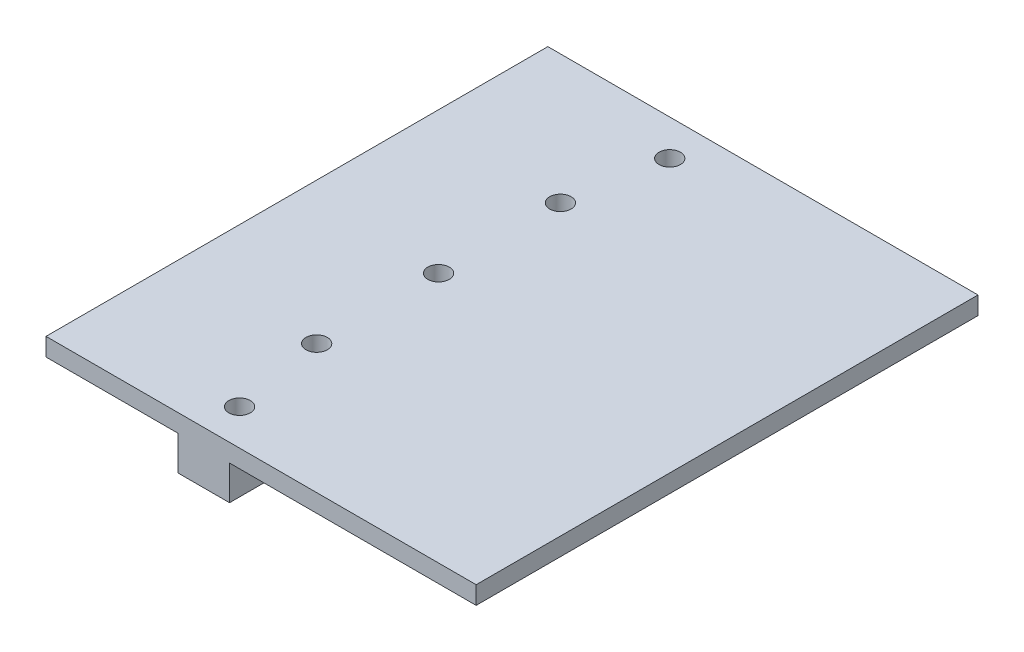
ISO-10303-21;
HEADER;
FILE_DESCRIPTION(('STEP AP214'),'2;1');
FILE_NAME('part.step','',(''),(''),'','','');
FILE_SCHEMA(('AUTOMOTIVE_DESIGN { 1 0 10303 214 1 1 1 1 }'));
ENDSEC;
DATA;
#1=APPLICATION_CONTEXT('core data for automotive mechanical design processes');
#2=APPLICATION_PROTOCOL_DEFINITION('international standard','automotive_design',2000,#1);
#3=PRODUCT_CONTEXT('',#1,'mechanical');
#4=PRODUCT('Part','Part','',(#3));
#5=PRODUCT_RELATED_PRODUCT_CATEGORY('part','',(#4));
#6=PRODUCT_DEFINITION_FORMATION('','',#4);
#7=PRODUCT_DEFINITION_CONTEXT('part definition',#1,'design');
#8=PRODUCT_DEFINITION('design','',#6,#7);
#9=PRODUCT_DEFINITION_SHAPE('','',#8);
#10=(LENGTH_UNIT() NAMED_UNIT(*) SI_UNIT(.MILLI.,.METRE.));
#11=(NAMED_UNIT(*) PLANE_ANGLE_UNIT() SI_UNIT($,.RADIAN.));
#12=(NAMED_UNIT(*) SI_UNIT($,.STERADIAN.) SOLID_ANGLE_UNIT());
#13=UNCERTAINTY_MEASURE_WITH_UNIT(LENGTH_MEASURE(1.E-05),#10,'distance_accuracy_value','');
#14=(GEOMETRIC_REPRESENTATION_CONTEXT(3) GLOBAL_UNCERTAINTY_ASSIGNED_CONTEXT((#13)) GLOBAL_UNIT_ASSIGNED_CONTEXT((#10,
#11,#12)) REPRESENTATION_CONTEXT('',''));
#15=CARTESIAN_POINT('',(0.,0.,0.));
#16=DIRECTION('',(0.,0.,1.));
#17=DIRECTION('',(1.,0.,0.));
#18=AXIS2_PLACEMENT_3D('',#15,#16,#17);
#19=CARTESIAN_POINT('',(-14.732,-6.096,44.45));
#20=DIRECTION('',(1.,0.,0.));
#21=DIRECTION('',(0.,0.,-1.));
#22=AXIS2_PLACEMENT_3D('',#19,#20,#21);
#23=PLANE('',#22);
#24=DIRECTION('',(0.,0.,-1.));
#25=VECTOR('',#24,1.);
#26=CARTESIAN_POINT('',(-14.732,0.,44.45));
#27=LINE('',#26,#25);
#28=CARTESIAN_POINT('',(-14.732,0.,-4.78102223780647));
#29=VERTEX_POINT('',#28);
#30=CARTESIAN_POINT('',(-14.732,0.,-16.8089777621935));
#31=VERTEX_POINT('',#30);
#32=EDGE_CURVE('E155',#29,#31,#27,.T.);
#33=ORIENTED_EDGE('',*,*,#32,.T.);
#34=DIRECTION('',(0.,-1.,0.));
#35=VECTOR('',#34,1.);
#36=CARTESIAN_POINT('',(-14.732,14.3684097937106,-16.8089777621935));
#37=LINE('',#36,#35);
#38=CARTESIAN_POINT('',(-14.732,-6.096,-16.8089777621935));
#39=VERTEX_POINT('',#38);
#40=EDGE_CURVE('E139',#31,#39,#37,.T.);
#41=ORIENTED_EDGE('',*,*,#40,.T.);
#42=DIRECTION('',(0.,0.,-1.));
#43=VECTOR('',#42,1.);
#44=CARTESIAN_POINT('',(-14.732,-6.096,44.45));
#45=LINE('',#44,#43);
#46=CARTESIAN_POINT('',(-14.732,-6.096,-4.78102223780647));
#47=VERTEX_POINT('',#46);
#48=EDGE_CURVE('E174',#47,#39,#45,.T.);
#49=ORIENTED_EDGE('',*,*,#48,.F.);
#50=DIRECTION('',(0.,-1.,0.));
#51=VECTOR('',#50,1.);
#52=CARTESIAN_POINT('',(-14.732,14.3684097937106,-4.78102223780647));
#53=LINE('',#52,#51);
#54=EDGE_CURVE('E244',#47,#29,#53,.F.);
#55=ORIENTED_EDGE('',*,*,#54,.T.);
#56=EDGE_LOOP('',(#33,#41,#49,#55));
#57=FACE_BOUND('',#56,.T.);
#58=ADVANCED_FACE('F33',(#57),#23,.F.);
#59=CARTESIAN_POINT('',(-14.732,0.,44.45));
#60=VERTEX_POINT('',#59);
#61=CARTESIAN_POINT('',(-14.732,0.,26.3710222378065));
#62=VERTEX_POINT('',#61);
#63=EDGE_CURVE('E159',#60,#62,#27,.T.);
#64=ORIENTED_EDGE('',*,*,#63,.T.);
#65=DIRECTION('',(0.,-1.,0.));
#66=VECTOR('',#65,1.);
#67=CARTESIAN_POINT('',(-14.732,14.3684097937106,26.3710222378065));
#68=LINE('',#67,#66);
#69=CARTESIAN_POINT('',(-14.732,-6.096,26.3710222378065));
#70=VERTEX_POINT('',#69);
#71=EDGE_CURVE('E230',#62,#70,#68,.T.);
#72=ORIENTED_EDGE('',*,*,#71,.T.);
#73=CARTESIAN_POINT('',(-14.732,-6.096,44.45));
#74=VERTEX_POINT('',#73);
#75=EDGE_CURVE('E177',#74,#70,#45,.T.);
#76=ORIENTED_EDGE('',*,*,#75,.F.);
#77=DIRECTION('',(0.,1.,0.));
#78=VECTOR('',#77,1.);
#79=CARTESIAN_POINT('',(-14.732,-6.096,44.45));
#80=LINE('',#79,#78);
#81=EDGE_CURVE('E179',#74,#60,#80,.T.);
#82=ORIENTED_EDGE('',*,*,#81,.T.);
#83=EDGE_LOOP('',(#64,#72,#76,#82));
#84=FACE_BOUND('',#83,.T.);
#85=ADVANCED_FACE('F228',(#84),#23,.F.);
#86=CARTESIAN_POINT('',(-14.732,-6.096,16.8089777621935));
#87=VERTEX_POINT('',#86);
#88=CARTESIAN_POINT('',(-14.732,-6.096,4.78102223780647));
#89=VERTEX_POINT('',#88);
#90=EDGE_CURVE('E176',#87,#89,#45,.T.);
#91=ORIENTED_EDGE('',*,*,#90,.F.);
#92=DIRECTION('',(0.,-1.,0.));
#93=VECTOR('',#92,1.);
#94=CARTESIAN_POINT('',(-14.732,14.3684097937106,16.8089777621935));
#95=LINE('',#94,#93);
#96=CARTESIAN_POINT('',(-14.732,0.,16.8089777621935));
#97=VERTEX_POINT('',#96);
#98=EDGE_CURVE('E250',#87,#97,#95,.F.);
#99=ORIENTED_EDGE('',*,*,#98,.T.);
#100=CARTESIAN_POINT('',(-14.732,0.,4.78102223780647));
#101=VERTEX_POINT('',#100);
#102=EDGE_CURVE('E158',#97,#101,#27,.T.);
#103=ORIENTED_EDGE('',*,*,#102,.T.);
#104=DIRECTION('',(0.,-1.,0.));
#105=VECTOR('',#104,1.);
#106=CARTESIAN_POINT('',(-14.732,14.3684097937106,4.78102223780647));
#107=LINE('',#106,#105);
#108=EDGE_CURVE('E259',#101,#89,#107,.T.);
#109=ORIENTED_EDGE('',*,*,#108,.T.);
#110=EDGE_LOOP('',(#91,#99,#103,#109));
#111=FACE_BOUND('',#110,.T.);
#112=ADVANCED_FACE('F297',(#111),#23,.F.);
#113=CARTESIAN_POINT('',(0.,0.,0.));
#114=DIRECTION('',(0.,-1.,0.));
#115=DIRECTION('',(0.,0.,-1.));
#116=AXIS2_PLACEMENT_3D('',#113,#114,#115);
#117=PLANE('',#116);
#118=CARTESIAN_POINT('',(-13.01496,0.,-21.59));
#119=DIRECTION('',(0.,-1.,0.));
#120=DIRECTION('',(0.,0.,-1.));
#121=AXIS2_PLACEMENT_3D('',#118,#119,#120);
#122=CIRCLE('',#121,5.08);
#123=CARTESIAN_POINT('',(-14.732,0.,-26.3710222378065));
#124=VERTEX_POINT('',#123);
#125=EDGE_CURVE('E133',#124,#31,#122,.F.);
#126=ORIENTED_EDGE('',*,*,#125,.T.);
#127=ORIENTED_EDGE('',*,*,#32,.F.);
#128=CARTESIAN_POINT('',(-13.01496,0.,0.));
#129=DIRECTION('',(0.,-1.,0.));
#130=DIRECTION('',(0.,0.,-1.));
#131=AXIS2_PLACEMENT_3D('',#128,#129,#130);
#132=CIRCLE('',#131,5.08);
#133=EDGE_CURVE('E255',#29,#101,#132,.F.);
#134=ORIENTED_EDGE('',*,*,#133,.T.);
#135=ORIENTED_EDGE('',*,*,#102,.F.);
#136=CARTESIAN_POINT('',(-13.01496,0.,21.59));
#137=DIRECTION('',(0.,-1.,0.));
#138=DIRECTION('',(0.,0.,-1.));
#139=AXIS2_PLACEMENT_3D('',#136,#137,#138);
#140=CIRCLE('',#139,5.08);
#141=EDGE_CURVE('E56',#97,#62,#140,.F.);
#142=ORIENTED_EDGE('',*,*,#141,.T.);
#143=ORIENTED_EDGE('',*,*,#63,.F.);
#144=DIRECTION('',(1.,0.,0.));
#145=VECTOR('',#144,1.);
#146=CARTESIAN_POINT('',(-38.1,0.,44.45));
#147=LINE('',#146,#145);
#148=CARTESIAN_POINT('',(-38.1,0.,44.45));
#149=VERTEX_POINT('',#148);
#150=EDGE_CURVE('E193',#149,#60,#147,.T.);
#151=ORIENTED_EDGE('',*,*,#150,.F.);
#152=DIRECTION('',(0.,0.,1.));
#153=VECTOR('',#152,1.);
#154=CARTESIAN_POINT('',(-38.1,0.,44.45));
#155=LINE('',#154,#153);
#156=CARTESIAN_POINT('',(-38.1,0.,-44.45));
#157=VERTEX_POINT('',#156);
#158=EDGE_CURVE('E205',#157,#149,#155,.T.);
#159=ORIENTED_EDGE('',*,*,#158,.F.);
#160=DIRECTION('',(-1.,0.,0.));
#161=VECTOR('',#160,1.);
#162=CARTESIAN_POINT('',(-38.1,0.,-44.45));
#163=LINE('',#162,#161);
#164=CARTESIAN_POINT('',(-14.732,0.,-44.45));
#165=VERTEX_POINT('',#164);
#166=EDGE_CURVE('E153',#165,#157,#163,.T.);
#167=ORIENTED_EDGE('',*,*,#166,.F.);
#168=EDGE_CURVE('E147',#124,#165,#27,.T.);
#169=ORIENTED_EDGE('',*,*,#168,.F.);
#170=EDGE_LOOP('',(#126,#127,#134,#135,#142,#143,#151,#159,#167,#169));
#171=FACE_BOUND('',#170,.T.);
#172=ADVANCED_FACE('F151',(#171),#117,.T.);
#173=CARTESIAN_POINT('',(38.1,3.175,44.45));
#174=DIRECTION('',(-1.,0.,0.));
#175=DIRECTION('',(0.,0.,1.));
#176=AXIS2_PLACEMENT_3D('',#173,#174,#175);
#177=PLANE('',#176);
#178=DIRECTION('',(0.,0.,-1.));
#179=VECTOR('',#178,1.);
#180=CARTESIAN_POINT('',(38.1,0.,44.45));
#181=LINE('',#180,#179);
#182=CARTESIAN_POINT('',(38.1,0.,44.45));
#183=VERTEX_POINT('',#182);
#184=CARTESIAN_POINT('',(38.1,0.,-44.45));
#185=VERTEX_POINT('',#184);
#186=EDGE_CURVE('E188',#183,#185,#181,.T.);
#187=ORIENTED_EDGE('',*,*,#186,.T.);
#188=DIRECTION('',(0.,-1.,0.));
#189=VECTOR('',#188,1.);
#190=CARTESIAN_POINT('',(38.1,3.175,-44.45));
#191=LINE('',#190,#189);
#192=CARTESIAN_POINT('',(38.1,3.175,-44.45));
#193=VERTEX_POINT('',#192);
#194=EDGE_CURVE('E11',#193,#185,#191,.T.);
#195=ORIENTED_EDGE('',*,*,#194,.F.);
#196=DIRECTION('',(0.,0.,-1.));
#197=VECTOR('',#196,1.);
#198=CARTESIAN_POINT('',(38.1,3.175,44.45));
#199=LINE('',#198,#197);
#200=CARTESIAN_POINT('',(38.1,3.175,44.45));
#201=VERTEX_POINT('',#200);
#202=EDGE_CURVE('E189',#201,#193,#199,.T.);
#203=ORIENTED_EDGE('',*,*,#202,.F.);
#204=DIRECTION('',(0.,-1.,0.));
#205=VECTOR('',#204,1.);
#206=CARTESIAN_POINT('',(38.1,3.175,44.45));
#207=LINE('',#206,#205);
#208=EDGE_CURVE('E199',#201,#183,#207,.T.);
#209=ORIENTED_EDGE('',*,*,#208,.T.);
#210=EDGE_LOOP('',(#187,#195,#203,#209));
#211=FACE_BOUND('',#210,.T.);
#212=ADVANCED_FACE('F35',(#211),#177,.F.);
#213=CARTESIAN_POINT('',(-38.1,3.175,-44.45));
#214=DIRECTION('',(0.,0.,1.));
#215=DIRECTION('',(1.,0.,0.));
#216=AXIS2_PLACEMENT_3D('',#213,#214,#215);
#217=PLANE('',#216);
#218=CARTESIAN_POINT('',(-5.58800000000002,0.,-44.45));
#219=VERTEX_POINT('',#218);
#220=EDGE_CURVE('E202',#185,#219,#163,.T.);
#221=ORIENTED_EDGE('',*,*,#220,.T.);
#222=DIRECTION('',(0.,1.,0.));
#223=VECTOR('',#222,1.);
#224=CARTESIAN_POINT('',(-5.58799999999999,-6.096,-44.45));
#225=LINE('',#224,#223);
#226=CARTESIAN_POINT('',(-5.58799999999999,-6.096,-44.45));
#227=VERTEX_POINT('',#226);
#228=EDGE_CURVE('E184',#227,#219,#225,.T.);
#229=ORIENTED_EDGE('',*,*,#228,.F.);
#230=DIRECTION('',(1.,0.,0.));
#231=VECTOR('',#230,1.);
#232=CARTESIAN_POINT('',(-14.732,-6.096,-44.45));
#233=LINE('',#232,#231);
#234=CARTESIAN_POINT('',(-14.732,-6.096,-44.45));
#235=VERTEX_POINT('',#234);
#236=EDGE_CURVE('E233',#235,#227,#233,.T.);
#237=ORIENTED_EDGE('',*,*,#236,.F.);
#238=DIRECTION('',(0.,1.,0.));
#239=VECTOR('',#238,1.);
#240=CARTESIAN_POINT('',(-14.732,-6.096,-44.45));
#241=LINE('',#240,#239);
#242=EDGE_CURVE('E186',#235,#165,#241,.T.);
#243=ORIENTED_EDGE('',*,*,#242,.T.);
#244=ORIENTED_EDGE('',*,*,#166,.T.);
#245=DIRECTION('',(0.,-1.,0.));
#246=VECTOR('',#245,1.);
#247=CARTESIAN_POINT('',(-38.1,3.175,-44.45));
#248=LINE('',#247,#246);
#249=CARTESIAN_POINT('',(-38.1,3.175,-44.45));
#250=VERTEX_POINT('',#249);
#251=EDGE_CURVE('E41',#250,#157,#248,.T.);
#252=ORIENTED_EDGE('',*,*,#251,.F.);
#253=DIRECTION('',(-1.,0.,0.));
#254=VECTOR('',#253,1.);
#255=CARTESIAN_POINT('',(-38.1,3.175,-44.45));
#256=LINE('',#255,#254);
#257=EDGE_CURVE('E192',#193,#250,#256,.T.);
#258=ORIENTED_EDGE('',*,*,#257,.F.);
#259=ORIENTED_EDGE('',*,*,#194,.T.);
#260=EDGE_LOOP('',(#221,#229,#237,#243,#244,#252,#258,#259));
#261=FACE_BOUND('',#260,.T.);
#262=ADVANCED_FACE('F284',(#261),#217,.F.);
#263=CARTESIAN_POINT('',(-38.1,3.175,44.45));
#264=DIRECTION('',(1.,0.,0.));
#265=DIRECTION('',(0.,0.,-1.));
#266=AXIS2_PLACEMENT_3D('',#263,#264,#265);
#267=PLANE('',#266);
#268=ORIENTED_EDGE('',*,*,#158,.T.);
#269=DIRECTION('',(0.,-1.,0.));
#270=VECTOR('',#269,1.);
#271=CARTESIAN_POINT('',(-38.1,3.175,44.45));
#272=LINE('',#271,#270);
#273=CARTESIAN_POINT('',(-38.1,3.175,44.45));
#274=VERTEX_POINT('',#273);
#275=EDGE_CURVE('E212',#274,#149,#272,.T.);
#276=ORIENTED_EDGE('',*,*,#275,.F.);
#277=DIRECTION('',(0.,0.,1.));
#278=VECTOR('',#277,1.);
#279=CARTESIAN_POINT('',(-38.1,3.175,44.45));
#280=LINE('',#279,#278);
#281=EDGE_CURVE('E195',#250,#274,#280,.T.);
#282=ORIENTED_EDGE('',*,*,#281,.F.);
#283=ORIENTED_EDGE('',*,*,#251,.T.);
#284=EDGE_LOOP('',(#268,#276,#282,#283));
#285=FACE_BOUND('',#284,.T.);
#286=ADVANCED_FACE('F218',(#285),#267,.F.);
#287=CARTESIAN_POINT('',(-38.1,3.175,44.45));
#288=DIRECTION('',(0.,0.,-1.));
#289=DIRECTION('',(-1.,0.,0.));
#290=AXIS2_PLACEMENT_3D('',#287,#288,#289);
#291=PLANE('',#290);
#292=ORIENTED_EDGE('',*,*,#150,.T.);
#293=ORIENTED_EDGE('',*,*,#81,.F.);
#294=DIRECTION('',(-1.,0.,0.));
#295=VECTOR('',#294,1.);
#296=CARTESIAN_POINT('',(-14.732,-6.096,44.45));
#297=LINE('',#296,#295);
#298=CARTESIAN_POINT('',(-5.58800000000001,-6.096,44.45));
#299=VERTEX_POINT('',#298);
#300=EDGE_CURVE('E182',#299,#74,#297,.T.);
#301=ORIENTED_EDGE('',*,*,#300,.F.);
#302=DIRECTION('',(0.,1.,0.));
#303=VECTOR('',#302,1.);
#304=CARTESIAN_POINT('',(-5.58800000000001,-6.096,44.45));
#305=LINE('',#304,#303);
#306=CARTESIAN_POINT('',(-5.58800000000001,0.,44.45));
#307=VERTEX_POINT('',#306);
#308=EDGE_CURVE('E181',#299,#307,#305,.T.);
#309=ORIENTED_EDGE('',*,*,#308,.T.);
#310=EDGE_CURVE('E207',#307,#183,#147,.T.);
#311=ORIENTED_EDGE('',*,*,#310,.T.);
#312=ORIENTED_EDGE('',*,*,#208,.F.);
#313=DIRECTION('',(1.,0.,0.));
#314=VECTOR('',#313,1.);
#315=CARTESIAN_POINT('',(-38.1,3.175,44.45));
#316=LINE('',#315,#314);
#317=EDGE_CURVE('E197',#274,#201,#316,.T.);
#318=ORIENTED_EDGE('',*,*,#317,.F.);
#319=ORIENTED_EDGE('',*,*,#275,.T.);
#320=EDGE_LOOP('',(#292,#293,#301,#309,#311,#312,#318,#319));
#321=FACE_BOUND('',#320,.T.);
#322=ADVANCED_FACE('F224',(#321),#291,.F.);
#323=CARTESIAN_POINT('',(0.,3.175,0.));
#324=DIRECTION('',(0.,-1.,0.));
#325=DIRECTION('',(0.,0.,-1.));
#326=AXIS2_PLACEMENT_3D('',#323,#324,#325);
#327=PLANE('',#326);
#328=CARTESIAN_POINT('',(-13.01496,3.175,0.));
#329=DIRECTION('',(0.,1.,0.));
#330=DIRECTION('',(0.,0.,1.));
#331=AXIS2_PLACEMENT_3D('',#328,#329,#330);
#332=CIRCLE('',#331,1.89864999999999);
#333=CARTESIAN_POINT('',(-13.01496,3.175,1.89864999999999));
#334=VERTEX_POINT('',#333);
#335=EDGE_CURVE('E346',#334,#334,#332,.T.);
#336=ORIENTED_EDGE('',*,*,#335,.F.);
#337=EDGE_LOOP('',(#336));
#338=FACE_BOUND('',#337,.T.);
#339=CARTESIAN_POINT('',(-13.01496,3.175,-21.59));
#340=DIRECTION('',(0.,1.,0.));
#341=DIRECTION('',(0.,0.,1.));
#342=AXIS2_PLACEMENT_3D('',#339,#340,#341);
#343=CIRCLE('',#342,1.89864999999999);
#344=CARTESIAN_POINT('',(-13.01496,3.175,-19.69135));
#345=VERTEX_POINT('',#344);
#346=EDGE_CURVE('E348',#345,#345,#343,.T.);
#347=ORIENTED_EDGE('',*,*,#346,.F.);
#348=EDGE_LOOP('',(#347));
#349=FACE_BOUND('',#348,.T.);
#350=CARTESIAN_POINT('',(-13.01496,3.175,21.59));
#351=DIRECTION('',(0.,1.,0.));
#352=DIRECTION('',(0.,0.,1.));
#353=AXIS2_PLACEMENT_3D('',#350,#351,#352);
#354=CIRCLE('',#353,1.89864999999999);
#355=CARTESIAN_POINT('',(-13.01496,3.175,23.48865));
#356=VERTEX_POINT('',#355);
#357=EDGE_CURVE('E356',#356,#356,#354,.T.);
#358=ORIENTED_EDGE('',*,*,#357,.F.);
#359=EDGE_LOOP('',(#358));
#360=FACE_BOUND('',#359,.T.);
#361=CARTESIAN_POINT('',(-10.16,3.175,-38.1));
#362=DIRECTION('',(0.,1.,0.));
#363=DIRECTION('',(0.,0.,1.));
#364=AXIS2_PLACEMENT_3D('',#361,#362,#363);
#365=CIRCLE('',#364,1.89864999999999);
#366=CARTESIAN_POINT('',(-10.16,3.175,-36.20135));
#367=VERTEX_POINT('',#366);
#368=EDGE_CURVE('E262',#367,#367,#365,.T.);
#369=ORIENTED_EDGE('',*,*,#368,.F.);
#370=EDGE_LOOP('',(#369));
#371=FACE_BOUND('',#370,.T.);
#372=CARTESIAN_POINT('',(-10.16,3.175,38.1));
#373=DIRECTION('',(0.,1.,0.));
#374=DIRECTION('',(0.,0.,1.));
#375=AXIS2_PLACEMENT_3D('',#372,#373,#374);
#376=CIRCLE('',#375,1.89864999999999);
#377=CARTESIAN_POINT('',(-10.16,3.175,39.99865));
#378=VERTEX_POINT('',#377);
#379=EDGE_CURVE('E161',#378,#378,#376,.T.);
#380=ORIENTED_EDGE('',*,*,#379,.F.);
#381=EDGE_LOOP('',(#380));
#382=FACE_BOUND('',#381,.T.);
#383=ORIENTED_EDGE('',*,*,#202,.T.);
#384=ORIENTED_EDGE('',*,*,#257,.T.);
#385=ORIENTED_EDGE('',*,*,#281,.T.);
#386=ORIENTED_EDGE('',*,*,#317,.T.);
#387=EDGE_LOOP('',(#383,#384,#385,#386));
#388=FACE_BOUND('',#387,.T.);
#389=ADVANCED_FACE('F273',(#338,#349,#360,#371,#382,#388),#327,.F.);
#390=DIRECTION('',(0.,0.,1.));
#391=VECTOR('',#390,1.);
#392=CARTESIAN_POINT('',(-5.58800000000001,0.,44.45));
#393=LINE('',#392,#391);
#394=EDGE_CURVE('E165',#219,#307,#393,.T.);
#395=ORIENTED_EDGE('',*,*,#394,.F.);
#396=ORIENTED_EDGE('',*,*,#220,.F.);
#397=ORIENTED_EDGE('',*,*,#186,.F.);
#398=ORIENTED_EDGE('',*,*,#310,.F.);
#399=EDGE_LOOP('',(#395,#396,#397,#398));
#400=FACE_BOUND('',#399,.T.);
#401=ADVANCED_FACE('F276',(#400),#117,.T.);
#402=CARTESIAN_POINT('',(-14.732,-6.096,-26.3710222378065));
#403=VERTEX_POINT('',#402);
#404=EDGE_CURVE('E149',#403,#235,#45,.T.);
#405=ORIENTED_EDGE('',*,*,#404,.F.);
#406=DIRECTION('',(0.,-1.,0.));
#407=VECTOR('',#406,1.);
#408=CARTESIAN_POINT('',(-14.732,14.3684097937106,-26.3710222378065));
#409=LINE('',#408,#407);
#410=EDGE_CURVE('E136',#403,#124,#409,.F.);
#411=ORIENTED_EDGE('',*,*,#410,.T.);
#412=ORIENTED_EDGE('',*,*,#168,.T.);
#413=ORIENTED_EDGE('',*,*,#242,.F.);
#414=EDGE_LOOP('',(#405,#411,#412,#413));
#415=FACE_BOUND('',#414,.T.);
#416=ADVANCED_FACE('F145',(#415),#23,.F.);
#417=CARTESIAN_POINT('',(-5.58800000000001,-6.096,44.45));
#418=DIRECTION('',(-1.,0.,0.));
#419=DIRECTION('',(0.,0.,1.));
#420=AXIS2_PLACEMENT_3D('',#417,#418,#419);
#421=PLANE('',#420);
#422=ORIENTED_EDGE('',*,*,#394,.T.);
#423=ORIENTED_EDGE('',*,*,#308,.F.);
#424=DIRECTION('',(0.,0.,1.));
#425=VECTOR('',#424,1.);
#426=CARTESIAN_POINT('',(-5.58800000000001,-6.096,44.45));
#427=LINE('',#426,#425);
#428=EDGE_CURVE('E234',#227,#299,#427,.T.);
#429=ORIENTED_EDGE('',*,*,#428,.F.);
#430=ORIENTED_EDGE('',*,*,#228,.T.);
#431=EDGE_LOOP('',(#422,#423,#429,#430));
#432=FACE_BOUND('',#431,.T.);
#433=ADVANCED_FACE('F289',(#432),#421,.F.);
#434=CARTESIAN_POINT('',(0.,-6.096,0.));
#435=DIRECTION('',(0.,-1.,0.));
#436=DIRECTION('',(0.,0.,-1.));
#437=AXIS2_PLACEMENT_3D('',#434,#435,#436);
#438=PLANE('',#437);
#439=CARTESIAN_POINT('',(-13.01496,-6.096,0.));
#440=DIRECTION('',(0.,1.,0.));
#441=DIRECTION('',(0.,0.,1.));
#442=AXIS2_PLACEMENT_3D('',#439,#440,#441);
#443=CIRCLE('',#442,1.89865);
#444=CARTESIAN_POINT('',(-13.01496,-6.096,1.89865));
#445=VERTEX_POINT('',#444);
#446=EDGE_CURVE('E343',#445,#445,#443,.T.);
#447=ORIENTED_EDGE('',*,*,#446,.T.);
#448=EDGE_LOOP('',(#447));
#449=FACE_BOUND('',#448,.T.);
#450=CARTESIAN_POINT('',(-13.01496,-6.096,-21.59));
#451=DIRECTION('',(0.,1.,0.));
#452=DIRECTION('',(0.,0.,1.));
#453=AXIS2_PLACEMENT_3D('',#450,#451,#452);
#454=CIRCLE('',#453,1.89865);
#455=CARTESIAN_POINT('',(-13.01496,-6.096,-19.69135));
#456=VERTEX_POINT('',#455);
#457=EDGE_CURVE('E353',#456,#456,#454,.T.);
#458=ORIENTED_EDGE('',*,*,#457,.T.);
#459=EDGE_LOOP('',(#458));
#460=FACE_BOUND('',#459,.T.);
#461=CARTESIAN_POINT('',(-13.01496,-6.096,21.59));
#462=DIRECTION('',(0.,1.,0.));
#463=DIRECTION('',(0.,0.,1.));
#464=AXIS2_PLACEMENT_3D('',#461,#462,#463);
#465=CIRCLE('',#464,1.89865);
#466=CARTESIAN_POINT('',(-13.01496,-6.096,23.48865));
#467=VERTEX_POINT('',#466);
#468=EDGE_CURVE('E359',#467,#467,#465,.T.);
#469=ORIENTED_EDGE('',*,*,#468,.T.);
#470=EDGE_LOOP('',(#469));
#471=FACE_BOUND('',#470,.T.);
#472=ORIENTED_EDGE('',*,*,#48,.T.);
#473=CARTESIAN_POINT('',(-13.01496,-6.096,-21.59));
#474=DIRECTION('',(0.,-1.,0.));
#475=DIRECTION('',(0.,0.,-1.));
#476=AXIS2_PLACEMENT_3D('',#473,#474,#475);
#477=CIRCLE('',#476,5.08);
#478=EDGE_CURVE('E48',#39,#403,#477,.T.);
#479=ORIENTED_EDGE('',*,*,#478,.T.);
#480=ORIENTED_EDGE('',*,*,#404,.T.);
#481=ORIENTED_EDGE('',*,*,#236,.T.);
#482=ORIENTED_EDGE('',*,*,#428,.T.);
#483=ORIENTED_EDGE('',*,*,#300,.T.);
#484=ORIENTED_EDGE('',*,*,#75,.T.);
#485=CARTESIAN_POINT('',(-13.01496,-6.096,21.59));
#486=DIRECTION('',(0.,-1.,0.));
#487=DIRECTION('',(0.,0.,-1.));
#488=AXIS2_PLACEMENT_3D('',#485,#486,#487);
#489=CIRCLE('',#488,5.08);
#490=EDGE_CURVE('E245',#70,#87,#489,.T.);
#491=ORIENTED_EDGE('',*,*,#490,.T.);
#492=ORIENTED_EDGE('',*,*,#90,.T.);
#493=CARTESIAN_POINT('',(-13.01496,-6.096,0.));
#494=DIRECTION('',(0.,-1.,0.));
#495=DIRECTION('',(0.,0.,-1.));
#496=AXIS2_PLACEMENT_3D('',#493,#494,#495);
#497=CIRCLE('',#496,5.08);
#498=EDGE_CURVE('E240',#89,#47,#497,.T.);
#499=ORIENTED_EDGE('',*,*,#498,.T.);
#500=EDGE_LOOP('',(#472,#479,#480,#481,#482,#483,#484,#491,#492,#499));
#501=FACE_BOUND('',#500,.T.);
#502=CARTESIAN_POINT('',(-10.16,-6.096,-38.1));
#503=DIRECTION('',(0.,1.,0.));
#504=DIRECTION('',(0.,0.,1.));
#505=AXIS2_PLACEMENT_3D('',#502,#503,#504);
#506=CIRCLE('',#505,1.89865);
#507=CARTESIAN_POINT('',(-10.16,-6.096,-36.20135));
#508=VERTEX_POINT('',#507);
#509=EDGE_CURVE('E265',#508,#508,#506,.T.);
#510=ORIENTED_EDGE('',*,*,#509,.T.);
#511=EDGE_LOOP('',(#510));
#512=FACE_BOUND('',#511,.T.);
#513=CARTESIAN_POINT('',(-10.16,-6.096,38.1));
#514=DIRECTION('',(0.,1.,0.));
#515=DIRECTION('',(0.,0.,1.));
#516=AXIS2_PLACEMENT_3D('',#513,#514,#515);
#517=CIRCLE('',#516,1.89865);
#518=CARTESIAN_POINT('',(-10.16,-6.096,39.99865));
#519=VERTEX_POINT('',#518);
#520=EDGE_CURVE('E156',#519,#519,#517,.T.);
#521=ORIENTED_EDGE('',*,*,#520,.T.);
#522=EDGE_LOOP('',(#521));
#523=FACE_BOUND('',#522,.T.);
#524=ADVANCED_FACE('F237',(#449,#460,#471,#501,#512,#523),#438,.T.);
#525=CARTESIAN_POINT('',(-10.16,3.175,38.1));
#526=DIRECTION('',(0.,1.,0.));
#527=DIRECTION('',(0.,0.,1.));
#528=AXIS2_PLACEMENT_3D('',#525,#526,#527);
#529=CYLINDRICAL_SURFACE('',#528,1.89864999999999);
#530=ORIENTED_EDGE('',*,*,#520,.F.);
#531=EDGE_LOOP('',(#530));
#532=FACE_BOUND('',#531,.T.);
#533=ORIENTED_EDGE('',*,*,#379,.T.);
#534=EDGE_LOOP('',(#533));
#535=FACE_BOUND('',#534,.T.);
#536=ADVANCED_FACE('F271',(#532,#535),#529,.F.);
#537=CARTESIAN_POINT('',(-10.16,3.175,-38.1));
#538=DIRECTION('',(0.,1.,0.));
#539=DIRECTION('',(0.,0.,1.));
#540=AXIS2_PLACEMENT_3D('',#537,#538,#539);
#541=CYLINDRICAL_SURFACE('',#540,1.89864999999999);
#542=ORIENTED_EDGE('',*,*,#509,.F.);
#543=EDGE_LOOP('',(#542));
#544=FACE_BOUND('',#543,.T.);
#545=ORIENTED_EDGE('',*,*,#368,.T.);
#546=EDGE_LOOP('',(#545));
#547=FACE_BOUND('',#546,.T.);
#548=ADVANCED_FACE('F312',(#544,#547),#541,.F.);
#549=CARTESIAN_POINT('',(-13.01496,14.3684097937106,0.));
#550=DIRECTION('',(0.,-1.,0.));
#551=DIRECTION('',(0.,0.,-1.));
#552=AXIS2_PLACEMENT_3D('',#549,#550,#551);
#553=CYLINDRICAL_SURFACE('',#552,5.08);
#554=ORIENTED_EDGE('',*,*,#108,.F.);
#555=ORIENTED_EDGE('',*,*,#133,.F.);
#556=ORIENTED_EDGE('',*,*,#54,.F.);
#557=ORIENTED_EDGE('',*,*,#498,.F.);
#558=EDGE_LOOP('',(#554,#555,#556,#557));
#559=FACE_BOUND('',#558,.T.);
#560=ADVANCED_FACE('F316',(#559),#553,.T.);
#561=CARTESIAN_POINT('',(-13.01496,14.3684097937106,21.59));
#562=DIRECTION('',(0.,-1.,0.));
#563=DIRECTION('',(0.,0.,-1.));
#564=AXIS2_PLACEMENT_3D('',#561,#562,#563);
#565=CYLINDRICAL_SURFACE('',#564,5.08);
#566=ORIENTED_EDGE('',*,*,#71,.F.);
#567=ORIENTED_EDGE('',*,*,#141,.F.);
#568=ORIENTED_EDGE('',*,*,#98,.F.);
#569=ORIENTED_EDGE('',*,*,#490,.F.);
#570=EDGE_LOOP('',(#566,#567,#568,#569));
#571=FACE_BOUND('',#570,.T.);
#572=ADVANCED_FACE('F320',(#571),#565,.T.);
#573=CARTESIAN_POINT('',(-13.01496,14.3684097937106,-21.59));
#574=DIRECTION('',(0.,-1.,0.));
#575=DIRECTION('',(0.,0.,-1.));
#576=AXIS2_PLACEMENT_3D('',#573,#574,#575);
#577=CYLINDRICAL_SURFACE('',#576,5.08);
#578=ORIENTED_EDGE('',*,*,#40,.F.);
#579=ORIENTED_EDGE('',*,*,#125,.F.);
#580=ORIENTED_EDGE('',*,*,#410,.F.);
#581=ORIENTED_EDGE('',*,*,#478,.F.);
#582=EDGE_LOOP('',(#578,#579,#580,#581));
#583=FACE_BOUND('',#582,.T.);
#584=ADVANCED_FACE('F135',(#583),#577,.T.);
#585=CARTESIAN_POINT('',(-13.01496,3.175,21.59));
#586=DIRECTION('',(0.,1.,0.));
#587=DIRECTION('',(0.,0.,1.));
#588=AXIS2_PLACEMENT_3D('',#585,#586,#587);
#589=CYLINDRICAL_SURFACE('',#588,1.89864999999999);
#590=ORIENTED_EDGE('',*,*,#468,.F.);
#591=EDGE_LOOP('',(#590));
#592=FACE_BOUND('',#591,.T.);
#593=ORIENTED_EDGE('',*,*,#357,.T.);
#594=EDGE_LOOP('',(#593));
#595=FACE_BOUND('',#594,.T.);
#596=ADVANCED_FACE('F327',(#592,#595),#589,.F.);
#597=CARTESIAN_POINT('',(-13.01496,3.175,-21.59));
#598=DIRECTION('',(0.,1.,0.));
#599=DIRECTION('',(0.,0.,1.));
#600=AXIS2_PLACEMENT_3D('',#597,#598,#599);
#601=CYLINDRICAL_SURFACE('',#600,1.89864999999999);
#602=ORIENTED_EDGE('',*,*,#457,.F.);
#603=EDGE_LOOP('',(#602));
#604=FACE_BOUND('',#603,.T.);
#605=ORIENTED_EDGE('',*,*,#346,.T.);
#606=EDGE_LOOP('',(#605));
#607=FACE_BOUND('',#606,.T.);
#608=ADVANCED_FACE('F330',(#604,#607),#601,.F.);
#609=CARTESIAN_POINT('',(-13.01496,3.175,0.));
#610=DIRECTION('',(0.,1.,0.));
#611=DIRECTION('',(0.,0.,1.));
#612=AXIS2_PLACEMENT_3D('',#609,#610,#611);
#613=CYLINDRICAL_SURFACE('',#612,1.89864999999999);
#614=ORIENTED_EDGE('',*,*,#446,.F.);
#615=EDGE_LOOP('',(#614));
#616=FACE_BOUND('',#615,.T.);
#617=ORIENTED_EDGE('',*,*,#335,.T.);
#618=EDGE_LOOP('',(#617));
#619=FACE_BOUND('',#618,.T.);
#620=ADVANCED_FACE('F334',(#616,#619),#613,.F.);
#621=CLOSED_SHELL('',(#58,#85,#112,#172,#212,#262,#286,#322,#389,#401,#416,#433,#524,#536,#548,
#560,#572,#584,#596,#608,#620));
#622=MANIFOLD_SOLID_BREP('B2',#621);
#623=ADVANCED_BREP_SHAPE_REPRESENTATION('',(#18,#622),#14);
#624=SHAPE_DEFINITION_REPRESENTATION(#9,#623);
ENDSEC;
END-ISO-10303-21;
